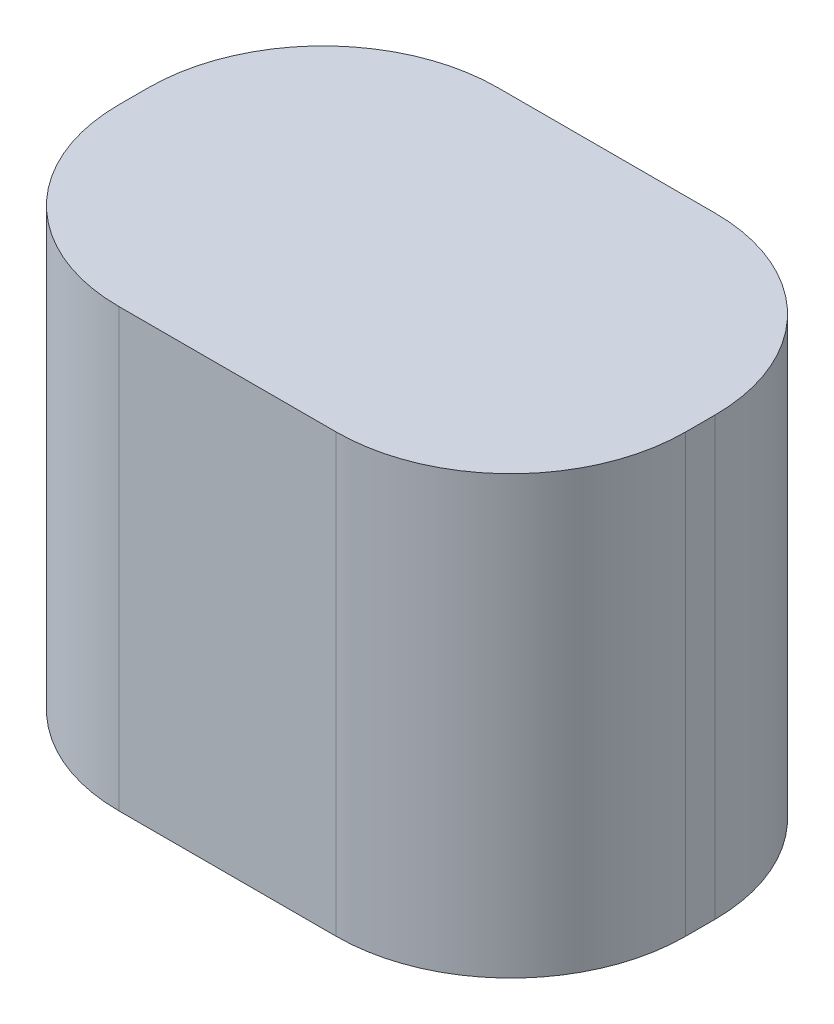
ISO-10303-21;
HEADER;
FILE_DESCRIPTION(('STEP AP214'),'2;1');
FILE_NAME('part.step','',(''),(''),'','','');
FILE_SCHEMA(('AUTOMOTIVE_DESIGN { 1 0 10303 214 1 1 1 1 }'));
ENDSEC;
DATA;
#1=APPLICATION_CONTEXT('core data for automotive mechanical design processes');
#2=APPLICATION_PROTOCOL_DEFINITION('international standard','automotive_design',2000,#1);
#3=PRODUCT_CONTEXT('',#1,'mechanical');
#4=PRODUCT('Part','Part','',(#3));
#5=PRODUCT_RELATED_PRODUCT_CATEGORY('part','',(#4));
#6=PRODUCT_DEFINITION_FORMATION('','',#4);
#7=PRODUCT_DEFINITION_CONTEXT('part definition',#1,'design');
#8=PRODUCT_DEFINITION('design','',#6,#7);
#9=PRODUCT_DEFINITION_SHAPE('','',#8);
#10=(LENGTH_UNIT() NAMED_UNIT(*) SI_UNIT(.MILLI.,.METRE.));
#11=(NAMED_UNIT(*) PLANE_ANGLE_UNIT() SI_UNIT($,.RADIAN.));
#12=(NAMED_UNIT(*) SI_UNIT($,.STERADIAN.) SOLID_ANGLE_UNIT());
#13=UNCERTAINTY_MEASURE_WITH_UNIT(LENGTH_MEASURE(1.E-05),#10,'distance_accuracy_value','');
#14=(GEOMETRIC_REPRESENTATION_CONTEXT(3) GLOBAL_UNCERTAINTY_ASSIGNED_CONTEXT((#13)) GLOBAL_UNIT_ASSIGNED_CONTEXT((#10,
#11,#12)) REPRESENTATION_CONTEXT('',''));
#15=CARTESIAN_POINT('',(0.,0.,0.));
#16=DIRECTION('',(0.,0.,1.));
#17=DIRECTION('',(1.,0.,0.));
#18=AXIS2_PLACEMENT_3D('',#15,#16,#17);
#19=CARTESIAN_POINT('',(0.,76.2,0.));
#20=DIRECTION('',(1.,0.,0.));
#21=DIRECTION('',(0.,0.,-1.));
#22=AXIS2_PLACEMENT_3D('',#19,#20,#21);
#23=PLANE('',#22);
#24=DIRECTION('',(0.,0.,1.));
#25=VECTOR('',#24,1.);
#26=CARTESIAN_POINT('',(0.,76.2,0.));
#27=LINE('',#26,#25);
#28=CARTESIAN_POINT('',(0.,76.2,-35.6397759534417));
#29=VERTEX_POINT('',#28);
#30=CARTESIAN_POINT('',(0.,76.2,-30.48));
#31=VERTEX_POINT('',#30);
#32=EDGE_CURVE('E134',#29,#31,#27,.T.);
#33=ORIENTED_EDGE('',*,*,#32,.F.);
#34=DIRECTION('',(0.,-1.,0.));
#35=VECTOR('',#34,1.);
#36=CARTESIAN_POINT('',(0.,76.2,-35.6397759534417));
#37=LINE('',#36,#35);
#38=CARTESIAN_POINT('',(0.,0.,-35.6397759534417));
#39=VERTEX_POINT('',#38);
#40=EDGE_CURVE('E173',#29,#39,#37,.T.);
#41=ORIENTED_EDGE('',*,*,#40,.T.);
#42=DIRECTION('',(0.,0.,1.));
#43=VECTOR('',#42,1.);
#44=CARTESIAN_POINT('',(0.,0.,0.));
#45=LINE('',#44,#43);
#46=CARTESIAN_POINT('',(0.,0.,-30.48));
#47=VERTEX_POINT('',#46);
#48=EDGE_CURVE('E184',#39,#47,#45,.T.);
#49=ORIENTED_EDGE('',*,*,#48,.T.);
#50=DIRECTION('',(0.,-1.,0.));
#51=VECTOR('',#50,1.);
#52=CARTESIAN_POINT('',(0.,76.2,-30.48));
#53=LINE('',#52,#51);
#54=EDGE_CURVE('E170',#47,#31,#53,.F.);
#55=ORIENTED_EDGE('',*,*,#54,.T.);
#56=EDGE_LOOP('',(#33,#41,#49,#55));
#57=FACE_BOUND('',#56,.T.);
#58=ADVANCED_FACE('F39',(#57),#23,.F.);
#59=CARTESIAN_POINT('',(0.,76.2,0.));
#60=DIRECTION('',(0.,0.,-1.));
#61=DIRECTION('',(-1.,0.,0.));
#62=AXIS2_PLACEMENT_3D('',#59,#60,#61);
#63=PLANE('',#62);
#64=DIRECTION('',(1.,0.,0.));
#65=VECTOR('',#64,1.);
#66=CARTESIAN_POINT('',(0.,0.,0.));
#67=LINE('',#66,#65);
#68=CARTESIAN_POINT('',(30.48,0.,0.));
#69=VERTEX_POINT('',#68);
#70=CARTESIAN_POINT('',(68.3929859340891,0.,0.));
#71=VERTEX_POINT('',#70);
#72=EDGE_CURVE('E141',#69,#71,#67,.T.);
#73=ORIENTED_EDGE('',*,*,#72,.T.);
#74=DIRECTION('',(0.,-1.,0.));
#75=VECTOR('',#74,1.);
#76=CARTESIAN_POINT('',(68.3929859340891,76.2,0.));
#77=LINE('',#76,#75);
#78=CARTESIAN_POINT('',(68.3929859340891,76.2,0.));
#79=VERTEX_POINT('',#78);
#80=EDGE_CURVE('E11',#71,#79,#77,.F.);
#81=ORIENTED_EDGE('',*,*,#80,.T.);
#82=DIRECTION('',(1.,0.,0.));
#83=VECTOR('',#82,1.);
#84=CARTESIAN_POINT('',(0.,76.2,0.));
#85=LINE('',#84,#83);
#86=CARTESIAN_POINT('',(30.48,76.2,0.));
#87=VERTEX_POINT('',#86);
#88=EDGE_CURVE('E139',#87,#79,#85,.T.);
#89=ORIENTED_EDGE('',*,*,#88,.F.);
#90=DIRECTION('',(0.,-1.,0.));
#91=VECTOR('',#90,1.);
#92=CARTESIAN_POINT('',(30.48,76.2,0.));
#93=LINE('',#92,#91);
#94=EDGE_CURVE('E48',#87,#69,#93,.T.);
#95=ORIENTED_EDGE('',*,*,#94,.T.);
#96=EDGE_LOOP('',(#73,#81,#89,#95));
#97=FACE_BOUND('',#96,.T.);
#98=ADVANCED_FACE('F180',(#97),#63,.F.);
#99=CARTESIAN_POINT('',(98.8729859340891,76.2,0.));
#100=DIRECTION('',(-1.,0.,0.));
#101=DIRECTION('',(0.,0.,1.));
#102=AXIS2_PLACEMENT_3D('',#99,#100,#101);
#103=PLANE('',#102);
#104=DIRECTION('',(0.,0.,-1.));
#105=VECTOR('',#104,1.);
#106=CARTESIAN_POINT('',(98.8729859340891,0.,0.));
#107=LINE('',#106,#105);
#108=CARTESIAN_POINT('',(98.8729859340891,0.,-30.48));
#109=VERTEX_POINT('',#108);
#110=CARTESIAN_POINT('',(98.8729859340891,0.,-35.6397759534417));
#111=VERTEX_POINT('',#110);
#112=EDGE_CURVE('E135',#109,#111,#107,.T.);
#113=ORIENTED_EDGE('',*,*,#112,.T.);
#114=DIRECTION('',(0.,-1.,0.));
#115=VECTOR('',#114,1.);
#116=CARTESIAN_POINT('',(98.8729859340891,76.2,-35.6397759534417));
#117=LINE('',#116,#115);
#118=CARTESIAN_POINT('',(98.8729859340891,76.2,-35.6397759534417));
#119=VERTEX_POINT('',#118);
#120=EDGE_CURVE('E110',#111,#119,#117,.F.);
#121=ORIENTED_EDGE('',*,*,#120,.T.);
#122=DIRECTION('',(0.,0.,-1.));
#123=VECTOR('',#122,1.);
#124=CARTESIAN_POINT('',(98.8729859340891,76.2,0.));
#125=LINE('',#124,#123);
#126=CARTESIAN_POINT('',(98.8729859340891,76.2,-30.48));
#127=VERTEX_POINT('',#126);
#128=EDGE_CURVE('E190',#127,#119,#125,.T.);
#129=ORIENTED_EDGE('',*,*,#128,.F.);
#130=DIRECTION('',(0.,-1.,0.));
#131=VECTOR('',#130,1.);
#132=CARTESIAN_POINT('',(98.8729859340891,76.2,-30.48));
#133=LINE('',#132,#131);
#134=EDGE_CURVE('E116',#127,#109,#133,.T.);
#135=ORIENTED_EDGE('',*,*,#134,.T.);
#136=EDGE_LOOP('',(#113,#121,#129,#135));
#137=FACE_BOUND('',#136,.T.);
#138=ADVANCED_FACE('F202',(#137),#103,.F.);
#139=CARTESIAN_POINT('',(0.,76.2,-66.1197759534417));
#140=DIRECTION('',(0.,0.,1.));
#141=DIRECTION('',(1.,0.,0.));
#142=AXIS2_PLACEMENT_3D('',#139,#140,#141);
#143=PLANE('',#142);
#144=DIRECTION('',(-1.,0.,0.));
#145=VECTOR('',#144,1.);
#146=CARTESIAN_POINT('',(0.,76.2,-66.1197759534417));
#147=LINE('',#146,#145);
#148=CARTESIAN_POINT('',(68.3929859340891,76.2,-66.1197759534417));
#149=VERTEX_POINT('',#148);
#150=CARTESIAN_POINT('',(30.48,76.2,-66.1197759534417));
#151=VERTEX_POINT('',#150);
#152=EDGE_CURVE('E126',#149,#151,#147,.T.);
#153=ORIENTED_EDGE('',*,*,#152,.F.);
#154=DIRECTION('',(0.,-1.,0.));
#155=VECTOR('',#154,1.);
#156=CARTESIAN_POINT('',(68.3929859340891,76.2,-66.1197759534417));
#157=LINE('',#156,#155);
#158=CARTESIAN_POINT('',(68.3929859340891,0.,-66.1197759534417));
#159=VERTEX_POINT('',#158);
#160=EDGE_CURVE('E109',#149,#159,#157,.T.);
#161=ORIENTED_EDGE('',*,*,#160,.T.);
#162=DIRECTION('',(-1.,0.,0.));
#163=VECTOR('',#162,1.);
#164=CARTESIAN_POINT('',(0.,0.,-66.1197759534417));
#165=LINE('',#164,#163);
#166=CARTESIAN_POINT('',(30.48,0.,-66.1197759534417));
#167=VERTEX_POINT('',#166);
#168=EDGE_CURVE('E123',#159,#167,#165,.T.);
#169=ORIENTED_EDGE('',*,*,#168,.T.);
#170=DIRECTION('',(0.,-1.,0.));
#171=VECTOR('',#170,1.);
#172=CARTESIAN_POINT('',(30.48,76.2,-66.1197759534417));
#173=LINE('',#172,#171);
#174=EDGE_CURVE('E129',#167,#151,#173,.F.);
#175=ORIENTED_EDGE('',*,*,#174,.T.);
#176=EDGE_LOOP('',(#153,#161,#169,#175));
#177=FACE_BOUND('',#176,.T.);
#178=ADVANCED_FACE('F122',(#177),#143,.F.);
#179=CARTESIAN_POINT('',(0.,76.2,0.));
#180=DIRECTION('',(0.,-1.,0.));
#181=DIRECTION('',(0.,0.,-1.));
#182=AXIS2_PLACEMENT_3D('',#179,#180,#181);
#183=PLANE('',#182);
#184=ORIENTED_EDGE('',*,*,#128,.T.);
#185=CARTESIAN_POINT('',(68.3929859340891,76.2,-35.6397759534417));
#186=DIRECTION('',(0.,-1.,0.));
#187=DIRECTION('',(0.,0.,-1.));
#188=AXIS2_PLACEMENT_3D('',#185,#186,#187);
#189=CIRCLE('',#188,30.48);
#190=EDGE_CURVE('E167',#119,#149,#189,.F.);
#191=ORIENTED_EDGE('',*,*,#190,.T.);
#192=ORIENTED_EDGE('',*,*,#152,.T.);
#193=CARTESIAN_POINT('',(30.48,76.2,-35.6397759534417));
#194=DIRECTION('',(0.,-1.,0.));
#195=DIRECTION('',(0.,0.,-1.));
#196=AXIS2_PLACEMENT_3D('',#193,#194,#195);
#197=CIRCLE('',#196,30.48);
#198=EDGE_CURVE('E164',#151,#29,#197,.F.);
#199=ORIENTED_EDGE('',*,*,#198,.T.);
#200=ORIENTED_EDGE('',*,*,#32,.T.);
#201=CARTESIAN_POINT('',(30.48,76.2,-30.48));
#202=DIRECTION('',(0.,-1.,0.));
#203=DIRECTION('',(0.,0.,-1.));
#204=AXIS2_PLACEMENT_3D('',#201,#202,#203);
#205=CIRCLE('',#204,30.48);
#206=EDGE_CURVE('E60',#31,#87,#205,.F.);
#207=ORIENTED_EDGE('',*,*,#206,.T.);
#208=ORIENTED_EDGE('',*,*,#88,.T.);
#209=CARTESIAN_POINT('',(68.3929859340891,76.2,-30.48));
#210=DIRECTION('',(0.,-1.,0.));
#211=DIRECTION('',(0.,0.,-1.));
#212=AXIS2_PLACEMENT_3D('',#209,#210,#211);
#213=CIRCLE('',#212,30.48);
#214=EDGE_CURVE('E161',#79,#127,#213,.F.);
#215=ORIENTED_EDGE('',*,*,#214,.T.);
#216=EDGE_LOOP('',(#184,#191,#192,#199,#200,#207,#208,#215));
#217=FACE_BOUND('',#216,.T.);
#218=ADVANCED_FACE('F196',(#217),#183,.F.);
#219=CARTESIAN_POINT('',(0.,0.,0.));
#220=DIRECTION('',(0.,-1.,0.));
#221=DIRECTION('',(0.,0.,-1.));
#222=AXIS2_PLACEMENT_3D('',#219,#220,#221);
#223=PLANE('',#222);
#224=ORIENTED_EDGE('',*,*,#168,.F.);
#225=CARTESIAN_POINT('',(68.3929859340891,0.,-35.6397759534417));
#226=DIRECTION('',(0.,-1.,0.));
#227=DIRECTION('',(0.,0.,-1.));
#228=AXIS2_PLACEMENT_3D('',#225,#226,#227);
#229=CIRCLE('',#228,30.48);
#230=EDGE_CURVE('E105',#159,#111,#229,.T.);
#231=ORIENTED_EDGE('',*,*,#230,.T.);
#232=ORIENTED_EDGE('',*,*,#112,.F.);
#233=CARTESIAN_POINT('',(68.3929859340891,0.,-30.48));
#234=DIRECTION('',(0.,-1.,0.));
#235=DIRECTION('',(0.,0.,-1.));
#236=AXIS2_PLACEMENT_3D('',#233,#234,#235);
#237=CIRCLE('',#236,30.48);
#238=EDGE_CURVE('E149',#109,#71,#237,.T.);
#239=ORIENTED_EDGE('',*,*,#238,.T.);
#240=ORIENTED_EDGE('',*,*,#72,.F.);
#241=CARTESIAN_POINT('',(30.48,0.,-30.48));
#242=DIRECTION('',(0.,-1.,0.));
#243=DIRECTION('',(0.,0.,-1.));
#244=AXIS2_PLACEMENT_3D('',#241,#242,#243);
#245=CIRCLE('',#244,30.48);
#246=EDGE_CURVE('E128',#69,#47,#245,.T.);
#247=ORIENTED_EDGE('',*,*,#246,.T.);
#248=ORIENTED_EDGE('',*,*,#48,.F.);
#249=CARTESIAN_POINT('',(30.48,0.,-35.6397759534417));
#250=DIRECTION('',(0.,-1.,0.));
#251=DIRECTION('',(0.,0.,-1.));
#252=AXIS2_PLACEMENT_3D('',#249,#250,#251);
#253=CIRCLE('',#252,30.48);
#254=EDGE_CURVE('E117',#39,#167,#253,.T.);
#255=ORIENTED_EDGE('',*,*,#254,.T.);
#256=EDGE_LOOP('',(#224,#231,#232,#239,#240,#247,#248,#255));
#257=FACE_BOUND('',#256,.T.);
#258=ADVANCED_FACE('F131',(#257),#223,.T.);
#259=CARTESIAN_POINT('',(68.3929859340891,76.2,-35.6397759534417));
#260=DIRECTION('',(0.,-1.,0.));
#261=DIRECTION('',(0.,0.,-1.));
#262=AXIS2_PLACEMENT_3D('',#259,#260,#261);
#263=CYLINDRICAL_SURFACE('',#262,30.48);
#264=ORIENTED_EDGE('',*,*,#190,.F.);
#265=ORIENTED_EDGE('',*,*,#120,.F.);
#266=ORIENTED_EDGE('',*,*,#230,.F.);
#267=ORIENTED_EDGE('',*,*,#160,.F.);
#268=EDGE_LOOP('',(#264,#265,#266,#267));
#269=FACE_BOUND('',#268,.T.);
#270=ADVANCED_FACE('F108',(#269),#263,.T.);
#271=CARTESIAN_POINT('',(30.48,76.2,-35.6397759534417));
#272=DIRECTION('',(0.,-1.,0.));
#273=DIRECTION('',(0.,0.,-1.));
#274=AXIS2_PLACEMENT_3D('',#271,#272,#273);
#275=CYLINDRICAL_SURFACE('',#274,30.48);
#276=ORIENTED_EDGE('',*,*,#198,.F.);
#277=ORIENTED_EDGE('',*,*,#174,.F.);
#278=ORIENTED_EDGE('',*,*,#254,.F.);
#279=ORIENTED_EDGE('',*,*,#40,.F.);
#280=EDGE_LOOP('',(#276,#277,#278,#279));
#281=FACE_BOUND('',#280,.T.);
#282=ADVANCED_FACE('F207',(#281),#275,.T.);
#283=CARTESIAN_POINT('',(68.3929859340891,76.2,-30.48));
#284=DIRECTION('',(0.,-1.,0.));
#285=DIRECTION('',(0.,0.,-1.));
#286=AXIS2_PLACEMENT_3D('',#283,#284,#285);
#287=CYLINDRICAL_SURFACE('',#286,30.48);
#288=ORIENTED_EDGE('',*,*,#214,.F.);
#289=ORIENTED_EDGE('',*,*,#80,.F.);
#290=ORIENTED_EDGE('',*,*,#238,.F.);
#291=ORIENTED_EDGE('',*,*,#134,.F.);
#292=EDGE_LOOP('',(#288,#289,#290,#291));
#293=FACE_BOUND('',#292,.T.);
#294=ADVANCED_FACE('F200',(#293),#287,.T.);
#295=CARTESIAN_POINT('',(30.48,76.2,-30.48));
#296=DIRECTION('',(0.,-1.,0.));
#297=DIRECTION('',(0.,0.,-1.));
#298=AXIS2_PLACEMENT_3D('',#295,#296,#297);
#299=CYLINDRICAL_SURFACE('',#298,30.48);
#300=ORIENTED_EDGE('',*,*,#206,.F.);
#301=ORIENTED_EDGE('',*,*,#54,.F.);
#302=ORIENTED_EDGE('',*,*,#246,.F.);
#303=ORIENTED_EDGE('',*,*,#94,.F.);
#304=EDGE_LOOP('',(#300,#301,#302,#303));
#305=FACE_BOUND('',#304,.T.);
#306=ADVANCED_FACE('F41',(#305),#299,.T.);
#307=CLOSED_SHELL('',(#58,#98,#138,#178,#218,#258,#270,#282,#294,#306));
#308=MANIFOLD_SOLID_BREP('B2',#307);
#309=ADVANCED_BREP_SHAPE_REPRESENTATION('',(#18,#308),#14);
#310=SHAPE_DEFINITION_REPRESENTATION(#9,#309);
ENDSEC;
END-ISO-10303-21;
